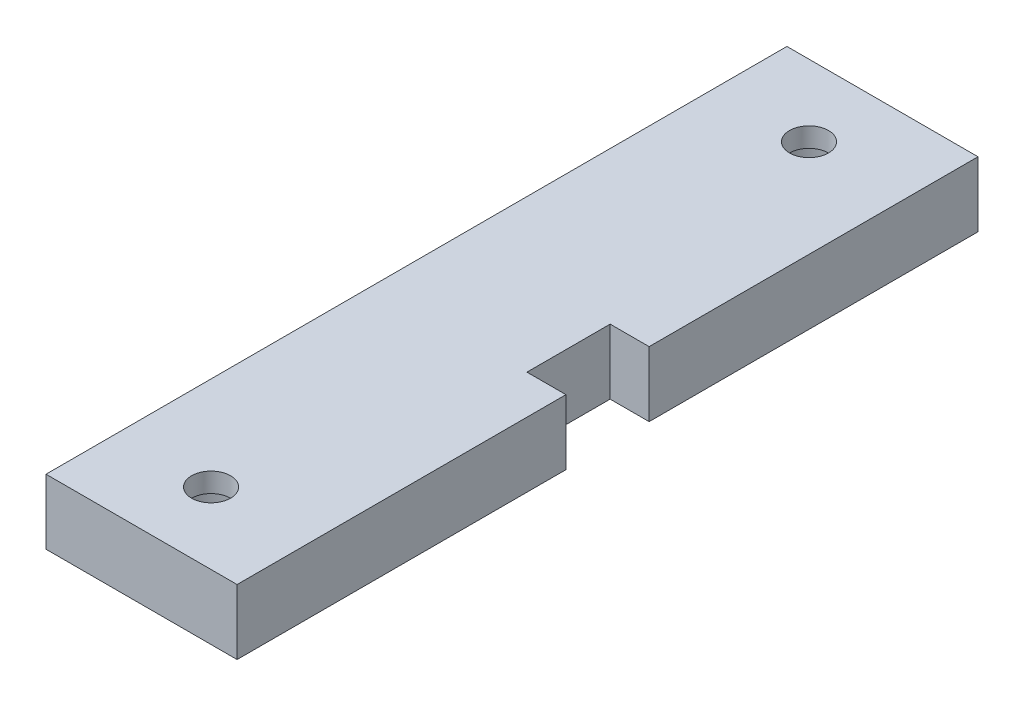
ISO-10303-21;
HEADER;
FILE_DESCRIPTION(('STEP AP214'),'2;1');
FILE_NAME('part.step','',(''),(''),'','','');
FILE_SCHEMA(('AUTOMOTIVE_DESIGN { 1 0 10303 214 1 1 1 1 }'));
ENDSEC;
DATA;
#1=APPLICATION_CONTEXT('core data for automotive mechanical design processes');
#2=APPLICATION_PROTOCOL_DEFINITION('international standard','automotive_design',2000,#1);
#3=PRODUCT_CONTEXT('',#1,'mechanical');
#4=PRODUCT('Part','Part','',(#3));
#5=PRODUCT_RELATED_PRODUCT_CATEGORY('part','',(#4));
#6=PRODUCT_DEFINITION_FORMATION('','',#4);
#7=PRODUCT_DEFINITION_CONTEXT('part definition',#1,'design');
#8=PRODUCT_DEFINITION('design','',#6,#7);
#9=PRODUCT_DEFINITION_SHAPE('','',#8);
#10=(LENGTH_UNIT() NAMED_UNIT(*) SI_UNIT(.MILLI.,.METRE.));
#11=(NAMED_UNIT(*) PLANE_ANGLE_UNIT() SI_UNIT($,.RADIAN.));
#12=(NAMED_UNIT(*) SI_UNIT($,.STERADIAN.) SOLID_ANGLE_UNIT());
#13=UNCERTAINTY_MEASURE_WITH_UNIT(LENGTH_MEASURE(1.E-05),#10,'distance_accuracy_value','');
#14=(GEOMETRIC_REPRESENTATION_CONTEXT(3) GLOBAL_UNCERTAINTY_ASSIGNED_CONTEXT((#13)) GLOBAL_UNIT_ASSIGNED_CONTEXT((#10,
#11,#12)) REPRESENTATION_CONTEXT('',''));
#15=CARTESIAN_POINT('',(0.,0.,0.));
#16=DIRECTION('',(0.,0.,1.));
#17=DIRECTION('',(1.,0.,0.));
#18=AXIS2_PLACEMENT_3D('',#15,#16,#17);
#19=CARTESIAN_POINT('',(0.,5.,0.));
#20=DIRECTION('',(0.,-1.,0.));
#21=DIRECTION('',(0.,0.,-1.));
#22=AXIS2_PLACEMENT_3D('',#19,#20,#21);
#23=PLANE('',#22);
#24=CARTESIAN_POINT('',(-11.9306549314346,5.,36.9705817510549));
#25=DIRECTION('',(0.,1.,0.));
#26=DIRECTION('',(0.,0.,1.));
#27=AXIS2_PLACEMENT_3D('',#24,#25,#26);
#28=CIRCLE('',#27,1.5);
#29=CARTESIAN_POINT('',(-11.9306549314346,5.,38.4705817510549));
#30=VERTEX_POINT('',#29);
#31=EDGE_CURVE('E232',#30,#30,#28,.T.);
#32=ORIENTED_EDGE('',*,*,#31,.F.);
#33=EDGE_LOOP('',(#32));
#34=FACE_BOUND('',#33,.T.);
#35=CARTESIAN_POINT('',(-11.9306549314346,5.,-9.02941824894515));
#36=DIRECTION('',(0.,1.,0.));
#37=DIRECTION('',(0.,0.,1.));
#38=AXIS2_PLACEMENT_3D('',#35,#36,#37);
#39=CIRCLE('',#38,1.5);
#40=CARTESIAN_POINT('',(-11.9306549314346,5.,-7.52941824894515));
#41=VERTEX_POINT('',#40);
#42=EDGE_CURVE('E228',#41,#41,#39,.T.);
#43=ORIENTED_EDGE('',*,*,#42,.F.);
#44=EDGE_LOOP('',(#43));
#45=FACE_BOUND('',#44,.T.);
#46=DIRECTION('',(-1.,0.,0.));
#47=VECTOR('',#46,1.);
#48=CARTESIAN_POINT('',(0.,5.,10.7705817510548));
#49=LINE('',#48,#47);
#50=CARTESIAN_POINT('',(-4.43065493143459,5.,10.7705817510548));
#51=VERTEX_POINT('',#50);
#52=CARTESIAN_POINT('',(-7.4306549314346,5.,10.7705817510548));
#53=VERTEX_POINT('',#52);
#54=EDGE_CURVE('E158',#51,#53,#49,.T.);
#55=ORIENTED_EDGE('',*,*,#54,.F.);
#56=DIRECTION('',(0.,0.,1.));
#57=VECTOR('',#56,1.);
#58=CARTESIAN_POINT('',(-4.43065493143459,5.,-14.5294182489452));
#59=LINE('',#58,#57);
#60=CARTESIAN_POINT('',(-4.43065493143459,5.,-14.5294182489452));
#61=VERTEX_POINT('',#60);
#62=EDGE_CURVE('E200',#61,#51,#59,.T.);
#63=ORIENTED_EDGE('',*,*,#62,.F.);
#64=DIRECTION('',(1.,0.,0.));
#65=VECTOR('',#64,1.);
#66=CARTESIAN_POINT('',(-22.4306549314346,5.,-14.5294182489452));
#67=LINE('',#66,#65);
#68=CARTESIAN_POINT('',(-19.1306549314346,5.,-14.5294182489452));
#69=VERTEX_POINT('',#68);
#70=EDGE_CURVE('E72',#69,#61,#67,.T.);
#71=ORIENTED_EDGE('',*,*,#70,.F.);
#72=DIRECTION('',(0.,0.,-1.));
#73=VECTOR('',#72,1.);
#74=CARTESIAN_POINT('',(-19.1306549314346,5.,0.));
#75=LINE('',#74,#73);
#76=CARTESIAN_POINT('',(-19.1306549314346,5.,42.4705817510549));
#77=VERTEX_POINT('',#76);
#78=EDGE_CURVE('E188',#77,#69,#75,.T.);
#79=ORIENTED_EDGE('',*,*,#78,.F.);
#80=DIRECTION('',(1.,0.,0.));
#81=VECTOR('',#80,1.);
#82=CARTESIAN_POINT('',(-22.4306549314346,5.,42.4705817510549));
#83=LINE('',#82,#81);
#84=CARTESIAN_POINT('',(-4.43065493143459,5.,42.4705817510548));
#85=VERTEX_POINT('',#84);
#86=EDGE_CURVE('E12',#77,#85,#83,.T.);
#87=ORIENTED_EDGE('',*,*,#86,.T.);
#88=CARTESIAN_POINT('',(-4.43065493143459,5.,17.1705817510548));
#89=VERTEX_POINT('',#88);
#90=EDGE_CURVE('E102',#89,#85,#59,.T.);
#91=ORIENTED_EDGE('',*,*,#90,.F.);
#92=DIRECTION('',(-1.,0.,0.));
#93=VECTOR('',#92,1.);
#94=CARTESIAN_POINT('',(0.,5.,17.1705817510548));
#95=LINE('',#94,#93);
#96=CARTESIAN_POINT('',(-7.4306549314346,5.,17.1705817510548));
#97=VERTEX_POINT('',#96);
#98=EDGE_CURVE('E179',#89,#97,#95,.T.);
#99=ORIENTED_EDGE('',*,*,#98,.T.);
#100=DIRECTION('',(0.,0.,1.));
#101=VECTOR('',#100,1.);
#102=CARTESIAN_POINT('',(-7.4306549314346,5.,10.9705817510548));
#103=LINE('',#102,#101);
#104=EDGE_CURVE('E150',#53,#97,#103,.T.);
#105=ORIENTED_EDGE('',*,*,#104,.F.);
#106=EDGE_LOOP('',(#55,#63,#71,#79,#87,#91,#99,#105));
#107=FACE_BOUND('',#106,.T.);
#108=ADVANCED_FACE('F62',(#34,#45,#107),#23,.F.);
#109=CARTESIAN_POINT('',(0.,0.,0.));
#110=DIRECTION('',(0.,-1.,0.));
#111=DIRECTION('',(0.,0.,-1.));
#112=AXIS2_PLACEMENT_3D('',#109,#110,#111);
#113=PLANE('',#112);
#114=CARTESIAN_POINT('',(-11.9306549314346,0.,36.9705817510549));
#115=DIRECTION('',(0.,-1.,0.));
#116=DIRECTION('',(0.,0.,-1.));
#117=AXIS2_PLACEMENT_3D('',#114,#115,#116);
#118=CIRCLE('',#117,3.5);
#119=CARTESIAN_POINT('',(-11.9306549314346,0.,33.4705817510549));
#120=VERTEX_POINT('',#119);
#121=EDGE_CURVE('E208',#120,#120,#118,.T.);
#122=ORIENTED_EDGE('',*,*,#121,.F.);
#123=EDGE_LOOP('',(#122));
#124=FACE_BOUND('',#123,.T.);
#125=CARTESIAN_POINT('',(-11.9306549314346,0.,-9.02941824894515));
#126=DIRECTION('',(0.,-1.,0.));
#127=DIRECTION('',(0.,0.,-1.));
#128=AXIS2_PLACEMENT_3D('',#125,#126,#127);
#129=CIRCLE('',#128,3.5);
#130=CARTESIAN_POINT('',(-11.9306549314346,0.,-12.5294182489452));
#131=VERTEX_POINT('',#130);
#132=EDGE_CURVE('E224',#131,#131,#129,.T.);
#133=ORIENTED_EDGE('',*,*,#132,.F.);
#134=EDGE_LOOP('',(#133));
#135=FACE_BOUND('',#134,.T.);
#136=DIRECTION('',(0.,0.,1.));
#137=VECTOR('',#136,1.);
#138=CARTESIAN_POINT('',(-4.43065493143459,0.,-14.5294182489452));
#139=LINE('',#138,#137);
#140=CARTESIAN_POINT('',(-4.43065493143459,0.,-14.5294182489452));
#141=VERTEX_POINT('',#140);
#142=CARTESIAN_POINT('',(-4.43065493143459,0.,10.7705817510548));
#143=VERTEX_POINT('',#142);
#144=EDGE_CURVE('E163',#141,#143,#139,.T.);
#145=ORIENTED_EDGE('',*,*,#144,.T.);
#146=DIRECTION('',(-1.,0.,0.));
#147=VECTOR('',#146,1.);
#148=CARTESIAN_POINT('',(0.,0.,10.7705817510548));
#149=LINE('',#148,#147);
#150=CARTESIAN_POINT('',(-7.4306549314346,0.,10.7705817510548));
#151=VERTEX_POINT('',#150);
#152=EDGE_CURVE('E155',#143,#151,#149,.T.);
#153=ORIENTED_EDGE('',*,*,#152,.T.);
#154=DIRECTION('',(0.,0.,1.));
#155=VECTOR('',#154,1.);
#156=CARTESIAN_POINT('',(-7.4306549314346,0.,10.9705817510548));
#157=LINE('',#156,#155);
#158=CARTESIAN_POINT('',(-7.4306549314346,0.,17.1705817510548));
#159=VERTEX_POINT('',#158);
#160=EDGE_CURVE('E141',#151,#159,#157,.T.);
#161=ORIENTED_EDGE('',*,*,#160,.T.);
#162=DIRECTION('',(-1.,0.,0.));
#163=VECTOR('',#162,1.);
#164=CARTESIAN_POINT('',(-4.43065493143459,0.,17.1705817510548));
#165=LINE('',#164,#163);
#166=CARTESIAN_POINT('',(-4.43065493143459,0.,17.1705817510548));
#167=VERTEX_POINT('',#166);
#168=EDGE_CURVE('E165',#167,#159,#165,.T.);
#169=ORIENTED_EDGE('',*,*,#168,.F.);
#170=CARTESIAN_POINT('',(-4.4306549314346,0.,42.4705817510549));
#171=VERTEX_POINT('',#170);
#172=EDGE_CURVE('E80',#167,#171,#139,.T.);
#173=ORIENTED_EDGE('',*,*,#172,.T.);
#174=DIRECTION('',(1.,0.,0.));
#175=VECTOR('',#174,1.);
#176=CARTESIAN_POINT('',(-22.4306549314346,0.,42.4705817510549));
#177=LINE('',#176,#175);
#178=CARTESIAN_POINT('',(-19.1306549314346,0.,42.4705817510549));
#179=VERTEX_POINT('',#178);
#180=EDGE_CURVE('E237',#179,#171,#177,.T.);
#181=ORIENTED_EDGE('',*,*,#180,.F.);
#182=DIRECTION('',(0.,0.,-1.));
#183=VECTOR('',#182,1.);
#184=CARTESIAN_POINT('',(-19.1306549314346,0.,0.));
#185=LINE('',#184,#183);
#186=CARTESIAN_POINT('',(-19.1306549314346,0.,-14.5294182489452));
#187=VERTEX_POINT('',#186);
#188=EDGE_CURVE('E187',#179,#187,#185,.T.);
#189=ORIENTED_EDGE('',*,*,#188,.T.);
#190=DIRECTION('',(1.,0.,0.));
#191=VECTOR('',#190,1.);
#192=CARTESIAN_POINT('',(-22.4306549314346,0.,-14.5294182489452));
#193=LINE('',#192,#191);
#194=EDGE_CURVE('E88',#187,#141,#193,.T.);
#195=ORIENTED_EDGE('',*,*,#194,.T.);
#196=EDGE_LOOP('',(#145,#153,#161,#169,#173,#181,#189,#195));
#197=FACE_BOUND('',#196,.T.);
#198=ADVANCED_FACE('F162',(#124,#135,#197),#113,.T.);
#199=CARTESIAN_POINT('',(-4.43065493143459,0.,-14.5294182489452));
#200=DIRECTION('',(-1.,0.,0.));
#201=DIRECTION('',(0.,0.,1.));
#202=AXIS2_PLACEMENT_3D('',#199,#200,#201);
#203=PLANE('',#202);
#204=DIRECTION('',(0.,-1.,0.));
#205=VECTOR('',#204,1.);
#206=CARTESIAN_POINT('',(-4.43065493143459,10.,10.7705817510548));
#207=LINE('',#206,#205);
#208=EDGE_CURVE('E160',#51,#143,#207,.T.);
#209=ORIENTED_EDGE('',*,*,#208,.T.);
#210=ORIENTED_EDGE('',*,*,#144,.F.);
#211=DIRECTION('',(0.,1.,0.));
#212=VECTOR('',#211,1.);
#213=CARTESIAN_POINT('',(-4.43065493143459,0.,-14.5294182489452));
#214=LINE('',#213,#212);
#215=EDGE_CURVE('E204',#141,#61,#214,.T.);
#216=ORIENTED_EDGE('',*,*,#215,.T.);
#217=ORIENTED_EDGE('',*,*,#62,.T.);
#218=EDGE_LOOP('',(#209,#210,#216,#217));
#219=FACE_BOUND('',#218,.T.);
#220=ADVANCED_FACE('F270',(#219),#203,.F.);
#221=CARTESIAN_POINT('',(-22.4306549314346,5.,42.4705817510549));
#222=DIRECTION('',(0.,0.,-1.));
#223=DIRECTION('',(-1.,0.,0.));
#224=AXIS2_PLACEMENT_3D('',#221,#222,#223);
#225=PLANE('',#224);
#226=DIRECTION('',(0.,-1.,0.));
#227=VECTOR('',#226,1.);
#228=CARTESIAN_POINT('',(-19.1306549314346,5.,42.4705817510549));
#229=LINE('',#228,#227);
#230=EDGE_CURVE('E108',#77,#179,#229,.T.);
#231=ORIENTED_EDGE('',*,*,#230,.T.);
#232=ORIENTED_EDGE('',*,*,#180,.T.);
#233=DIRECTION('',(0.,1.,0.));
#234=VECTOR('',#233,1.);
#235=CARTESIAN_POINT('',(-4.43065493143459,0.,42.4705817510548));
#236=LINE('',#235,#234);
#237=EDGE_CURVE('E199',#171,#85,#236,.T.);
#238=ORIENTED_EDGE('',*,*,#237,.T.);
#239=ORIENTED_EDGE('',*,*,#86,.F.);
#240=EDGE_LOOP('',(#231,#232,#238,#239));
#241=FACE_BOUND('',#240,.T.);
#242=ADVANCED_FACE('F275',(#241),#225,.F.);
#243=ORIENTED_EDGE('',*,*,#172,.F.);
#244=DIRECTION('',(0.,-1.,0.));
#245=VECTOR('',#244,1.);
#246=CARTESIAN_POINT('',(-4.43065493143459,10.,17.1705817510548));
#247=LINE('',#246,#245);
#248=EDGE_CURVE('E168',#89,#167,#247,.T.);
#249=ORIENTED_EDGE('',*,*,#248,.F.);
#250=ORIENTED_EDGE('',*,*,#90,.T.);
#251=ORIENTED_EDGE('',*,*,#237,.F.);
#252=EDGE_LOOP('',(#243,#249,#250,#251));
#253=FACE_BOUND('',#252,.T.);
#254=ADVANCED_FACE('F259',(#253),#203,.F.);
#255=CARTESIAN_POINT('',(-11.9306549314346,0.,36.9705817510549));
#256=DIRECTION('',(0.,1.,0.));
#257=DIRECTION('',(0.,0.,1.));
#258=AXIS2_PLACEMENT_3D('',#255,#256,#257);
#259=CYLINDRICAL_SURFACE('',#258,1.5);
#260=ORIENTED_EDGE('',*,*,#31,.T.);
#261=EDGE_LOOP('',(#260));
#262=FACE_BOUND('',#261,.T.);
#263=CARTESIAN_POINT('',(-11.9306549314346,3.5,36.9705817510549));
#264=DIRECTION('',(0.,-1.,0.));
#265=DIRECTION('',(0.,0.,-1.));
#266=AXIS2_PLACEMENT_3D('',#263,#264,#265);
#267=CIRCLE('',#266,1.5);
#268=CARTESIAN_POINT('',(-11.9306549314346,3.5,35.4705817510549));
#269=VERTEX_POINT('',#268);
#270=EDGE_CURVE('E66',#269,#269,#267,.F.);
#271=ORIENTED_EDGE('',*,*,#270,.F.);
#272=EDGE_LOOP('',(#271));
#273=FACE_BOUND('',#272,.T.);
#274=ADVANCED_FACE('F250',(#262,#273),#259,.F.);
#275=CARTESIAN_POINT('',(-11.9306549314346,0.,-9.02941824894515));
#276=DIRECTION('',(0.,1.,0.));
#277=DIRECTION('',(0.,0.,1.));
#278=AXIS2_PLACEMENT_3D('',#275,#276,#277);
#279=CYLINDRICAL_SURFACE('',#278,1.5);
#280=ORIENTED_EDGE('',*,*,#42,.T.);
#281=EDGE_LOOP('',(#280));
#282=FACE_BOUND('',#281,.T.);
#283=CARTESIAN_POINT('',(-11.9306549314346,3.5,-9.02941824894515));
#284=DIRECTION('',(0.,-1.,0.));
#285=DIRECTION('',(0.,0.,-1.));
#286=AXIS2_PLACEMENT_3D('',#283,#284,#285);
#287=CIRCLE('',#286,1.5);
#288=CARTESIAN_POINT('',(-11.9306549314346,3.5,-10.5294182489452));
#289=VERTEX_POINT('',#288);
#290=EDGE_CURVE('E223',#289,#289,#287,.F.);
#291=ORIENTED_EDGE('',*,*,#290,.F.);
#292=EDGE_LOOP('',(#291));
#293=FACE_BOUND('',#292,.T.);
#294=ADVANCED_FACE('F248',(#282,#293),#279,.F.);
#295=CARTESIAN_POINT('',(-22.4306549314346,5.,-14.5294182489452));
#296=DIRECTION('',(0.,0.,-1.));
#297=DIRECTION('',(-1.,0.,0.));
#298=AXIS2_PLACEMENT_3D('',#295,#296,#297);
#299=PLANE('',#298);
#300=DIRECTION('',(0.,-1.,0.));
#301=VECTOR('',#300,1.);
#302=CARTESIAN_POINT('',(-19.1306549314346,10.,-14.5294182489452));
#303=LINE('',#302,#301);
#304=EDGE_CURVE('E183',#69,#187,#303,.T.);
#305=ORIENTED_EDGE('',*,*,#304,.F.);
#306=ORIENTED_EDGE('',*,*,#70,.T.);
#307=ORIENTED_EDGE('',*,*,#215,.F.);
#308=ORIENTED_EDGE('',*,*,#194,.F.);
#309=EDGE_LOOP('',(#305,#306,#307,#308));
#310=FACE_BOUND('',#309,.T.);
#311=ADVANCED_FACE('F64',(#310),#299,.T.);
#312=CARTESIAN_POINT('',(-11.9306549314346,3.5,-9.02941824894515));
#313=DIRECTION('',(0.,-1.,0.));
#314=DIRECTION('',(0.,0.,-1.));
#315=AXIS2_PLACEMENT_3D('',#312,#313,#314);
#316=PLANE('',#315);
#317=CARTESIAN_POINT('',(-11.9306549314346,3.5,-9.02941824894515));
#318=DIRECTION('',(0.,-1.,0.));
#319=DIRECTION('',(0.,0.,-1.));
#320=AXIS2_PLACEMENT_3D('',#317,#318,#319);
#321=CIRCLE('',#320,3.5);
#322=CARTESIAN_POINT('',(-11.9306549314346,3.5,-12.5294182489452));
#323=VERTEX_POINT('',#322);
#324=EDGE_CURVE('E219',#323,#323,#321,.T.);
#325=ORIENTED_EDGE('',*,*,#324,.T.);
#326=EDGE_LOOP('',(#325));
#327=FACE_BOUND('',#326,.T.);
#328=ORIENTED_EDGE('',*,*,#290,.T.);
#329=EDGE_LOOP('',(#328));
#330=FACE_BOUND('',#329,.T.);
#331=ADVANCED_FACE('F246',(#327,#330),#316,.T.);
#332=CARTESIAN_POINT('',(-11.9306549314346,3.5,-9.02941824894515));
#333=DIRECTION('',(0.,-1.,0.));
#334=DIRECTION('',(0.,0.,-1.));
#335=AXIS2_PLACEMENT_3D('',#332,#333,#334);
#336=CYLINDRICAL_SURFACE('',#335,3.5);
#337=ORIENTED_EDGE('',*,*,#324,.F.);
#338=EDGE_LOOP('',(#337));
#339=FACE_BOUND('',#338,.T.);
#340=ORIENTED_EDGE('',*,*,#132,.T.);
#341=EDGE_LOOP('',(#340));
#342=FACE_BOUND('',#341,.T.);
#343=ADVANCED_FACE('F304',(#339,#342),#336,.F.);
#344=CARTESIAN_POINT('',(-11.9306549314346,3.5,36.9705817510549));
#345=DIRECTION('',(0.,-1.,0.));
#346=DIRECTION('',(0.,0.,-1.));
#347=AXIS2_PLACEMENT_3D('',#344,#345,#346);
#348=PLANE('',#347);
#349=CARTESIAN_POINT('',(-11.9306549314346,3.5,36.9705817510549));
#350=DIRECTION('',(0.,-1.,0.));
#351=DIRECTION('',(0.,0.,-1.));
#352=AXIS2_PLACEMENT_3D('',#349,#350,#351);
#353=CIRCLE('',#352,3.5);
#354=CARTESIAN_POINT('',(-11.9306549314346,3.5,33.4705817510549));
#355=VERTEX_POINT('',#354);
#356=EDGE_CURVE('E212',#355,#355,#353,.T.);
#357=ORIENTED_EDGE('',*,*,#356,.T.);
#358=EDGE_LOOP('',(#357));
#359=FACE_BOUND('',#358,.T.);
#360=ORIENTED_EDGE('',*,*,#270,.T.);
#361=EDGE_LOOP('',(#360));
#362=FACE_BOUND('',#361,.T.);
#363=ADVANCED_FACE('F300',(#359,#362),#348,.T.);
#364=CARTESIAN_POINT('',(-11.9306549314346,3.5,36.9705817510549));
#365=DIRECTION('',(0.,-1.,0.));
#366=DIRECTION('',(0.,0.,-1.));
#367=AXIS2_PLACEMENT_3D('',#364,#365,#366);
#368=CYLINDRICAL_SURFACE('',#367,3.5);
#369=ORIENTED_EDGE('',*,*,#356,.F.);
#370=EDGE_LOOP('',(#369));
#371=FACE_BOUND('',#370,.T.);
#372=ORIENTED_EDGE('',*,*,#121,.T.);
#373=EDGE_LOOP('',(#372));
#374=FACE_BOUND('',#373,.T.);
#375=ADVANCED_FACE('F303',(#371,#374),#368,.F.);
#376=CARTESIAN_POINT('',(-7.4306549314346,0.,10.9705817510548));
#377=DIRECTION('',(-1.,0.,0.));
#378=DIRECTION('',(0.,0.,1.));
#379=AXIS2_PLACEMENT_3D('',#376,#377,#378);
#380=PLANE('',#379);
#381=ORIENTED_EDGE('',*,*,#104,.T.);
#382=DIRECTION('',(0.,-1.,0.));
#383=VECTOR('',#382,1.);
#384=CARTESIAN_POINT('',(-7.4306549314346,10.,17.1705817510548));
#385=LINE('',#384,#383);
#386=EDGE_CURVE('E146',#97,#159,#385,.T.);
#387=ORIENTED_EDGE('',*,*,#386,.T.);
#388=ORIENTED_EDGE('',*,*,#160,.F.);
#389=DIRECTION('',(0.,-1.,0.));
#390=VECTOR('',#389,1.);
#391=CARTESIAN_POINT('',(-7.4306549314346,10.,10.7705817510548));
#392=LINE('',#391,#390);
#393=EDGE_CURVE('E144',#53,#151,#392,.T.);
#394=ORIENTED_EDGE('',*,*,#393,.F.);
#395=EDGE_LOOP('',(#381,#387,#388,#394));
#396=FACE_BOUND('',#395,.T.);
#397=ADVANCED_FACE('F143',(#396),#380,.F.);
#398=CARTESIAN_POINT('',(-19.1306549314346,5.,0.));
#399=DIRECTION('',(-1.,0.,0.));
#400=DIRECTION('',(0.,0.,1.));
#401=AXIS2_PLACEMENT_3D('',#398,#399,#400);
#402=PLANE('',#401);
#403=ORIENTED_EDGE('',*,*,#188,.F.);
#404=ORIENTED_EDGE('',*,*,#230,.F.);
#405=ORIENTED_EDGE('',*,*,#78,.T.);
#406=ORIENTED_EDGE('',*,*,#304,.T.);
#407=EDGE_LOOP('',(#403,#404,#405,#406));
#408=FACE_BOUND('',#407,.T.);
#409=ADVANCED_FACE('F287',(#408),#402,.T.);
#410=CARTESIAN_POINT('',(0.,10.,10.7705817510548));
#411=DIRECTION('',(0.,0.,1.));
#412=DIRECTION('',(1.,0.,0.));
#413=AXIS2_PLACEMENT_3D('',#410,#411,#412);
#414=PLANE('',#413);
#415=ORIENTED_EDGE('',*,*,#54,.T.);
#416=ORIENTED_EDGE('',*,*,#393,.T.);
#417=ORIENTED_EDGE('',*,*,#152,.F.);
#418=ORIENTED_EDGE('',*,*,#208,.F.);
#419=EDGE_LOOP('',(#415,#416,#417,#418));
#420=FACE_BOUND('',#419,.T.);
#421=ADVANCED_FACE('F154',(#420),#414,.T.);
#422=CARTESIAN_POINT('',(-4.43065493143459,10.,17.1705817510548));
#423=DIRECTION('',(0.,0.,1.));
#424=DIRECTION('',(1.,0.,0.));
#425=AXIS2_PLACEMENT_3D('',#422,#423,#424);
#426=PLANE('',#425);
#427=ORIENTED_EDGE('',*,*,#248,.T.);
#428=ORIENTED_EDGE('',*,*,#168,.T.);
#429=ORIENTED_EDGE('',*,*,#386,.F.);
#430=ORIENTED_EDGE('',*,*,#98,.F.);
#431=EDGE_LOOP('',(#427,#428,#429,#430));
#432=FACE_BOUND('',#431,.T.);
#433=ADVANCED_FACE('F293',(#432),#426,.F.);
#434=CLOSED_SHELL('',(#108,#198,#220,#242,#254,#274,#294,#311,#331,#343,#363,#375,#397,#409,
#421,#433));
#435=MANIFOLD_SOLID_BREP('B2',#434);
#436=ADVANCED_BREP_SHAPE_REPRESENTATION('',(#18,#435),#14);
#437=SHAPE_DEFINITION_REPRESENTATION(#9,#436);
ENDSEC;
END-ISO-10303-21;
